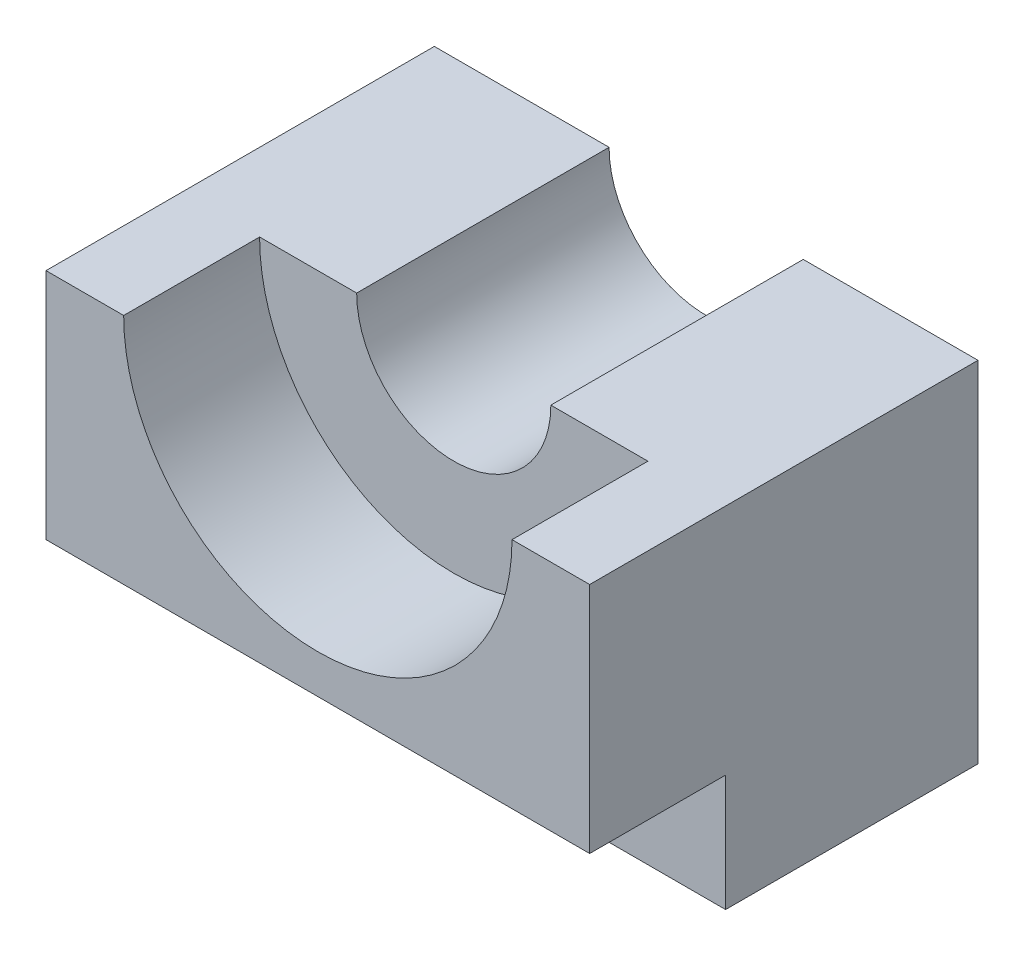
ISO-10303-21;
HEADER;
FILE_DESCRIPTION(('STEP AP214'),'2;1');
FILE_NAME('part.step','',(''),(''),'','','');
FILE_SCHEMA(('AUTOMOTIVE_DESIGN { 1 0 10303 214 1 1 1 1 }'));
ENDSEC;
DATA;
#1=APPLICATION_CONTEXT('core data for automotive mechanical design processes');
#2=APPLICATION_PROTOCOL_DEFINITION('international standard','automotive_design',2000,#1);
#3=PRODUCT_CONTEXT('',#1,'mechanical');
#4=PRODUCT('Part','Part','',(#3));
#5=PRODUCT_RELATED_PRODUCT_CATEGORY('part','',(#4));
#6=PRODUCT_DEFINITION_FORMATION('','',#4);
#7=PRODUCT_DEFINITION_CONTEXT('part definition',#1,'design');
#8=PRODUCT_DEFINITION('design','',#6,#7);
#9=PRODUCT_DEFINITION_SHAPE('','',#8);
#10=(LENGTH_UNIT() NAMED_UNIT(*) SI_UNIT(.MILLI.,.METRE.));
#11=(NAMED_UNIT(*) PLANE_ANGLE_UNIT() SI_UNIT($,.RADIAN.));
#12=(NAMED_UNIT(*) SI_UNIT($,.STERADIAN.) SOLID_ANGLE_UNIT());
#13=UNCERTAINTY_MEASURE_WITH_UNIT(LENGTH_MEASURE(1.E-05),#10,'distance_accuracy_value','');
#14=(GEOMETRIC_REPRESENTATION_CONTEXT(3) GLOBAL_UNCERTAINTY_ASSIGNED_CONTEXT((#13)) GLOBAL_UNIT_ASSIGNED_CONTEXT((#10,
#11,#12)) REPRESENTATION_CONTEXT('',''));
#15=CARTESIAN_POINT('',(0.,0.,0.));
#16=DIRECTION('',(0.,0.,1.));
#17=DIRECTION('',(1.,0.,0.));
#18=AXIS2_PLACEMENT_3D('',#15,#16,#17);
#19=CARTESIAN_POINT('',(0.,0.,13.));
#20=DIRECTION('',(0.,0.,1.));
#21=DIRECTION('',(1.,0.,0.));
#22=AXIS2_PLACEMENT_3D('',#19,#20,#21);
#23=PLANE('',#22);
#24=DIRECTION('',(1.,0.,0.));
#25=VECTOR('',#24,1.);
#26=CARTESIAN_POINT('',(0.,9.,13.));
#27=LINE('',#26,#25);
#28=CARTESIAN_POINT('',(-10.,9.,13.));
#29=VERTEX_POINT('',#28);
#30=CARTESIAN_POINT('',(-5.,9.,13.));
#31=VERTEX_POINT('',#30);
#32=EDGE_CURVE('E121',#29,#31,#27,.T.);
#33=ORIENTED_EDGE('',*,*,#32,.F.);
#34=CARTESIAN_POINT('',(0.,9.,13.));
#35=DIRECTION('',(0.,0.,1.));
#36=DIRECTION('',(1.,0.,0.));
#37=AXIS2_PLACEMENT_3D('',#34,#35,#36);
#38=CIRCLE('',#37,10.);
#39=CARTESIAN_POINT('',(10.,9.,13.));
#40=VERTEX_POINT('',#39);
#41=EDGE_CURVE('E11',#29,#40,#38,.T.);
#42=ORIENTED_EDGE('',*,*,#41,.T.);
#43=DIRECTION('',(1.,0.,0.));
#44=VECTOR('',#43,1.);
#45=CARTESIAN_POINT('',(0.,9.,13.));
#46=LINE('',#45,#44);
#47=CARTESIAN_POINT('',(5.,9.,13.));
#48=VERTEX_POINT('',#47);
#49=EDGE_CURVE('E99',#48,#40,#46,.T.);
#50=ORIENTED_EDGE('',*,*,#49,.F.);
#51=CARTESIAN_POINT('',(0.,9.,13.));
#52=DIRECTION('',(0.,0.,1.));
#53=DIRECTION('',(1.,0.,0.));
#54=AXIS2_PLACEMENT_3D('',#51,#52,#53);
#55=CIRCLE('',#54,5.);
#56=EDGE_CURVE('E95',#31,#48,#55,.T.);
#57=ORIENTED_EDGE('',*,*,#56,.F.);
#58=EDGE_LOOP('',(#33,#42,#50,#57));
#59=FACE_BOUND('',#58,.T.);
#60=ADVANCED_FACE('F47',(#59),#23,.T.);
#61=CARTESIAN_POINT('',(0.,9.,13.));
#62=DIRECTION('',(0.,0.,-1.));
#63=DIRECTION('',(-1.,0.,0.));
#64=AXIS2_PLACEMENT_3D('',#61,#62,#63);
#65=CYLINDRICAL_SURFACE('',#64,5.);
#66=CARTESIAN_POINT('',(0.,9.,0.));
#67=DIRECTION('',(0.,0.,1.));
#68=DIRECTION('',(1.,0.,0.));
#69=AXIS2_PLACEMENT_3D('',#66,#67,#68);
#70=CIRCLE('',#69,5.);
#71=CARTESIAN_POINT('',(-5.,9.,0.));
#72=VERTEX_POINT('',#71);
#73=CARTESIAN_POINT('',(5.,9.,0.));
#74=VERTEX_POINT('',#73);
#75=EDGE_CURVE('E92',#72,#74,#70,.T.);
#76=ORIENTED_EDGE('',*,*,#75,.F.);
#77=DIRECTION('',(0.,0.,-1.));
#78=VECTOR('',#77,1.);
#79=CARTESIAN_POINT('',(-5.,9.,13.));
#80=LINE('',#79,#78);
#81=EDGE_CURVE('E51',#31,#72,#80,.T.);
#82=ORIENTED_EDGE('',*,*,#81,.F.);
#83=ORIENTED_EDGE('',*,*,#56,.T.);
#84=DIRECTION('',(0.,0.,-1.));
#85=VECTOR('',#84,1.);
#86=CARTESIAN_POINT('',(5.,9.,13.));
#87=LINE('',#86,#85);
#88=EDGE_CURVE('E72',#48,#74,#87,.T.);
#89=ORIENTED_EDGE('',*,*,#88,.T.);
#90=EDGE_LOOP('',(#76,#82,#83,#89));
#91=FACE_BOUND('',#90,.T.);
#92=ADVANCED_FACE('F49',(#91),#65,.F.);
#93=CARTESIAN_POINT('',(0.,9.,13.));
#94=DIRECTION('',(0.,1.,0.));
#95=DIRECTION('',(0.,0.,1.));
#96=AXIS2_PLACEMENT_3D('',#93,#94,#95);
#97=PLANE('',#96);
#98=DIRECTION('',(1.,0.,0.));
#99=VECTOR('',#98,1.);
#100=CARTESIAN_POINT('',(0.,9.,0.));
#101=LINE('',#100,#99);
#102=CARTESIAN_POINT('',(-14.,9.,0.));
#103=VERTEX_POINT('',#102);
#104=EDGE_CURVE('E108',#103,#72,#101,.T.);
#105=ORIENTED_EDGE('',*,*,#104,.F.);
#106=DIRECTION('',(0.,0.,-1.));
#107=VECTOR('',#106,1.);
#108=CARTESIAN_POINT('',(-14.,9.,13.));
#109=LINE('',#108,#107);
#110=CARTESIAN_POINT('',(-14.,9.,20.));
#111=VERTEX_POINT('',#110);
#112=EDGE_CURVE('E128',#111,#103,#109,.T.);
#113=ORIENTED_EDGE('',*,*,#112,.F.);
#114=DIRECTION('',(-1.,0.,0.));
#115=VECTOR('',#114,1.);
#116=CARTESIAN_POINT('',(0.,9.,20.));
#117=LINE('',#116,#115);
#118=CARTESIAN_POINT('',(-10.,9.,20.));
#119=VERTEX_POINT('',#118);
#120=EDGE_CURVE('E183',#119,#111,#117,.T.);
#121=ORIENTED_EDGE('',*,*,#120,.F.);
#122=DIRECTION('',(0.,0.,-1.));
#123=VECTOR('',#122,1.);
#124=CARTESIAN_POINT('',(-10.,9.,20.));
#125=LINE('',#124,#123);
#126=EDGE_CURVE('E110',#119,#29,#125,.T.);
#127=ORIENTED_EDGE('',*,*,#126,.T.);
#128=ORIENTED_EDGE('',*,*,#32,.T.);
#129=ORIENTED_EDGE('',*,*,#81,.T.);
#130=EDGE_LOOP('',(#105,#113,#121,#127,#128,#129));
#131=FACE_BOUND('',#130,.T.);
#132=ADVANCED_FACE('F136',(#131),#97,.T.);
#133=CARTESIAN_POINT('',(-14.,0.,13.));
#134=DIRECTION('',(-1.,0.,0.));
#135=DIRECTION('',(0.,0.,1.));
#136=AXIS2_PLACEMENT_3D('',#133,#134,#135);
#137=PLANE('',#136);
#138=DIRECTION('',(0.,1.,0.));
#139=VECTOR('',#138,1.);
#140=CARTESIAN_POINT('',(-14.,0.,0.));
#141=LINE('',#140,#139);
#142=CARTESIAN_POINT('',(-14.,-9.,0.));
#143=VERTEX_POINT('',#142);
#144=EDGE_CURVE('E123',#143,#103,#141,.T.);
#145=ORIENTED_EDGE('',*,*,#144,.F.);
#146=DIRECTION('',(0.,0.,-1.));
#147=VECTOR('',#146,1.);
#148=CARTESIAN_POINT('',(-14.,-9.,13.));
#149=LINE('',#148,#147);
#150=CARTESIAN_POINT('',(-14.,-9.,13.));
#151=VERTEX_POINT('',#150);
#152=EDGE_CURVE('E157',#151,#143,#149,.T.);
#153=ORIENTED_EDGE('',*,*,#152,.F.);
#154=DIRECTION('',(0.,1.,0.));
#155=VECTOR('',#154,1.);
#156=CARTESIAN_POINT('',(-14.,0.,13.));
#157=LINE('',#156,#155);
#158=CARTESIAN_POINT('',(-14.,-3.,13.));
#159=VERTEX_POINT('',#158);
#160=EDGE_CURVE('E249',#151,#159,#157,.T.);
#161=ORIENTED_EDGE('',*,*,#160,.T.);
#162=DIRECTION('',(0.,0.,-1.));
#163=VECTOR('',#162,1.);
#164=CARTESIAN_POINT('',(-14.,-3.,20.));
#165=LINE('',#164,#163);
#166=CARTESIAN_POINT('',(-14.,-3.,20.));
#167=VERTEX_POINT('',#166);
#168=EDGE_CURVE('E209',#167,#159,#165,.T.);
#169=ORIENTED_EDGE('',*,*,#168,.F.);
#170=DIRECTION('',(0.,-1.,0.));
#171=VECTOR('',#170,1.);
#172=CARTESIAN_POINT('',(-14.,0.,20.));
#173=LINE('',#172,#171);
#174=EDGE_CURVE('E187',#111,#167,#173,.T.);
#175=ORIENTED_EDGE('',*,*,#174,.F.);
#176=ORIENTED_EDGE('',*,*,#112,.T.);
#177=EDGE_LOOP('',(#145,#153,#161,#169,#175,#176));
#178=FACE_BOUND('',#177,.T.);
#179=ADVANCED_FACE('F154',(#178),#137,.T.);
#180=CARTESIAN_POINT('',(14.,0.,13.));
#181=DIRECTION('',(-1.,0.,0.));
#182=DIRECTION('',(0.,0.,1.));
#183=AXIS2_PLACEMENT_3D('',#180,#181,#182);
#184=PLANE('',#183);
#185=DIRECTION('',(0.,0.,-1.));
#186=VECTOR('',#185,1.);
#187=CARTESIAN_POINT('',(14.,-9.,13.));
#188=LINE('',#187,#186);
#189=CARTESIAN_POINT('',(14.,-9.,13.));
#190=VERTEX_POINT('',#189);
#191=CARTESIAN_POINT('',(14.,-9.,0.));
#192=VERTEX_POINT('',#191);
#193=EDGE_CURVE('E170',#190,#192,#188,.T.);
#194=ORIENTED_EDGE('',*,*,#193,.T.);
#195=DIRECTION('',(0.,1.,0.));
#196=VECTOR('',#195,1.);
#197=CARTESIAN_POINT('',(14.,0.,0.));
#198=LINE('',#197,#196);
#199=CARTESIAN_POINT('',(14.,9.,0.));
#200=VERTEX_POINT('',#199);
#201=EDGE_CURVE('E117',#192,#200,#198,.T.);
#202=ORIENTED_EDGE('',*,*,#201,.T.);
#203=DIRECTION('',(0.,0.,-1.));
#204=VECTOR('',#203,1.);
#205=CARTESIAN_POINT('',(14.,9.,13.));
#206=LINE('',#205,#204);
#207=CARTESIAN_POINT('',(14.,9.,20.));
#208=VERTEX_POINT('',#207);
#209=EDGE_CURVE('E98',#208,#200,#206,.T.);
#210=ORIENTED_EDGE('',*,*,#209,.F.);
#211=DIRECTION('',(0.,1.,0.));
#212=VECTOR('',#211,1.);
#213=CARTESIAN_POINT('',(14.,0.,20.));
#214=LINE('',#213,#212);
#215=CARTESIAN_POINT('',(14.,-3.,20.));
#216=VERTEX_POINT('',#215);
#217=EDGE_CURVE('E195',#216,#208,#214,.T.);
#218=ORIENTED_EDGE('',*,*,#217,.F.);
#219=DIRECTION('',(0.,0.,-1.));
#220=VECTOR('',#219,1.);
#221=CARTESIAN_POINT('',(14.,-3.,20.));
#222=LINE('',#221,#220);
#223=CARTESIAN_POINT('',(14.,-3.,13.));
#224=VERTEX_POINT('',#223);
#225=EDGE_CURVE('E205',#216,#224,#222,.T.);
#226=ORIENTED_EDGE('',*,*,#225,.T.);
#227=DIRECTION('',(0.,1.,0.));
#228=VECTOR('',#227,1.);
#229=CARTESIAN_POINT('',(14.,0.,13.));
#230=LINE('',#229,#228);
#231=EDGE_CURVE('E177',#190,#224,#230,.T.);
#232=ORIENTED_EDGE('',*,*,#231,.F.);
#233=EDGE_LOOP('',(#194,#202,#210,#218,#226,#232));
#234=FACE_BOUND('',#233,.T.);
#235=ADVANCED_FACE('F241',(#234),#184,.F.);
#236=CARTESIAN_POINT('',(0.,9.,13.));
#237=DIRECTION('',(0.,1.,0.));
#238=DIRECTION('',(0.,0.,1.));
#239=AXIS2_PLACEMENT_3D('',#236,#237,#238);
#240=PLANE('',#239);
#241=DIRECTION('',(1.,0.,0.));
#242=VECTOR('',#241,1.);
#243=CARTESIAN_POINT('',(0.,9.,0.));
#244=LINE('',#243,#242);
#245=EDGE_CURVE('E105',#74,#200,#244,.T.);
#246=ORIENTED_EDGE('',*,*,#245,.F.);
#247=ORIENTED_EDGE('',*,*,#88,.F.);
#248=ORIENTED_EDGE('',*,*,#49,.T.);
#249=DIRECTION('',(0.,0.,-1.));
#250=VECTOR('',#249,1.);
#251=CARTESIAN_POINT('',(10.,9.,20.));
#252=LINE('',#251,#250);
#253=CARTESIAN_POINT('',(10.,9.,20.));
#254=VERTEX_POINT('',#253);
#255=EDGE_CURVE('E64',#254,#40,#252,.T.);
#256=ORIENTED_EDGE('',*,*,#255,.F.);
#257=DIRECTION('',(-1.,0.,0.));
#258=VECTOR('',#257,1.);
#259=CARTESIAN_POINT('',(0.,9.,20.));
#260=LINE('',#259,#258);
#261=EDGE_CURVE('E199',#208,#254,#260,.T.);
#262=ORIENTED_EDGE('',*,*,#261,.F.);
#263=ORIENTED_EDGE('',*,*,#209,.T.);
#264=EDGE_LOOP('',(#246,#247,#248,#256,#262,#263));
#265=FACE_BOUND('',#264,.T.);
#266=ADVANCED_FACE('F112',(#265),#240,.T.);
#267=CARTESIAN_POINT('',(0.,0.,0.));
#268=DIRECTION('',(0.,0.,1.));
#269=DIRECTION('',(1.,0.,0.));
#270=AXIS2_PLACEMENT_3D('',#267,#268,#269);
#271=PLANE('',#270);
#272=ORIENTED_EDGE('',*,*,#75,.T.);
#273=ORIENTED_EDGE('',*,*,#245,.T.);
#274=ORIENTED_EDGE('',*,*,#201,.F.);
#275=DIRECTION('',(1.,0.,0.));
#276=VECTOR('',#275,1.);
#277=CARTESIAN_POINT('',(0.,-9.,0.));
#278=LINE('',#277,#276);
#279=EDGE_CURVE('E151',#143,#192,#278,.T.);
#280=ORIENTED_EDGE('',*,*,#279,.F.);
#281=ORIENTED_EDGE('',*,*,#144,.T.);
#282=ORIENTED_EDGE('',*,*,#104,.T.);
#283=EDGE_LOOP('',(#272,#273,#274,#280,#281,#282));
#284=FACE_BOUND('',#283,.T.);
#285=ADVANCED_FACE('F103',(#284),#271,.F.);
#286=CARTESIAN_POINT('',(0.,9.,20.));
#287=DIRECTION('',(0.,0.,-1.));
#288=DIRECTION('',(-1.,0.,0.));
#289=AXIS2_PLACEMENT_3D('',#286,#287,#288);
#290=CYLINDRICAL_SURFACE('',#289,10.);
#291=ORIENTED_EDGE('',*,*,#41,.F.);
#292=ORIENTED_EDGE('',*,*,#126,.F.);
#293=CARTESIAN_POINT('',(0.,9.,20.));
#294=DIRECTION('',(0.,0.,1.));
#295=DIRECTION('',(1.,0.,0.));
#296=AXIS2_PLACEMENT_3D('',#293,#294,#295);
#297=CIRCLE('',#296,10.);
#298=EDGE_CURVE('E175',#119,#254,#297,.T.);
#299=ORIENTED_EDGE('',*,*,#298,.T.);
#300=ORIENTED_EDGE('',*,*,#255,.T.);
#301=EDGE_LOOP('',(#291,#292,#299,#300));
#302=FACE_BOUND('',#301,.T.);
#303=ADVANCED_FACE('F221',(#302),#290,.F.);
#304=CARTESIAN_POINT('',(0.,-3.,20.));
#305=DIRECTION('',(0.,1.,0.));
#306=DIRECTION('',(0.,0.,1.));
#307=AXIS2_PLACEMENT_3D('',#304,#305,#306);
#308=PLANE('',#307);
#309=DIRECTION('',(1.,0.,0.));
#310=VECTOR('',#309,1.);
#311=CARTESIAN_POINT('',(0.,-3.,13.));
#312=LINE('',#311,#310);
#313=EDGE_CURVE('E169',#159,#224,#312,.T.);
#314=ORIENTED_EDGE('',*,*,#313,.T.);
#315=ORIENTED_EDGE('',*,*,#225,.F.);
#316=DIRECTION('',(1.,0.,0.));
#317=VECTOR('',#316,1.);
#318=CARTESIAN_POINT('',(0.,-3.,20.));
#319=LINE('',#318,#317);
#320=EDGE_CURVE('E191',#167,#216,#319,.T.);
#321=ORIENTED_EDGE('',*,*,#320,.F.);
#322=ORIENTED_EDGE('',*,*,#168,.T.);
#323=EDGE_LOOP('',(#314,#315,#321,#322));
#324=FACE_BOUND('',#323,.T.);
#325=ADVANCED_FACE('F254',(#324),#308,.F.);
#326=CARTESIAN_POINT('',(0.,0.,20.));
#327=DIRECTION('',(0.,0.,1.));
#328=DIRECTION('',(1.,0.,0.));
#329=AXIS2_PLACEMENT_3D('',#326,#327,#328);
#330=PLANE('',#329);
#331=ORIENTED_EDGE('',*,*,#298,.F.);
#332=ORIENTED_EDGE('',*,*,#120,.T.);
#333=ORIENTED_EDGE('',*,*,#174,.T.);
#334=ORIENTED_EDGE('',*,*,#320,.T.);
#335=ORIENTED_EDGE('',*,*,#217,.T.);
#336=ORIENTED_EDGE('',*,*,#261,.T.);
#337=EDGE_LOOP('',(#331,#332,#333,#334,#335,#336));
#338=FACE_BOUND('',#337,.T.);
#339=ADVANCED_FACE('F236',(#338),#330,.T.);
#340=CARTESIAN_POINT('',(0.,-9.,13.));
#341=DIRECTION('',(0.,1.,0.));
#342=DIRECTION('',(0.,0.,1.));
#343=AXIS2_PLACEMENT_3D('',#340,#341,#342);
#344=PLANE('',#343);
#345=ORIENTED_EDGE('',*,*,#279,.T.);
#346=ORIENTED_EDGE('',*,*,#193,.F.);
#347=DIRECTION('',(1.,0.,0.));
#348=VECTOR('',#347,1.);
#349=CARTESIAN_POINT('',(0.,-9.,13.));
#350=LINE('',#349,#348);
#351=EDGE_CURVE('E166',#151,#190,#350,.T.);
#352=ORIENTED_EDGE('',*,*,#351,.F.);
#353=ORIENTED_EDGE('',*,*,#152,.T.);
#354=EDGE_LOOP('',(#345,#346,#352,#353));
#355=FACE_BOUND('',#354,.T.);
#356=ADVANCED_FACE('F162',(#355),#344,.F.);
#357=ORIENTED_EDGE('',*,*,#313,.F.);
#358=ORIENTED_EDGE('',*,*,#160,.F.);
#359=ORIENTED_EDGE('',*,*,#351,.T.);
#360=ORIENTED_EDGE('',*,*,#231,.T.);
#361=EDGE_LOOP('',(#357,#358,#359,#360));
#362=FACE_BOUND('',#361,.T.);
#363=ADVANCED_FACE('F248',(#362),#23,.T.);
#364=CLOSED_SHELL('',(#60,#92,#132,#179,#235,#266,#285,#303,#325,#339,#356,#363));
#365=MANIFOLD_SOLID_BREP('B2',#364);
#366=ADVANCED_BREP_SHAPE_REPRESENTATION('',(#18,#365),#14);
#367=SHAPE_DEFINITION_REPRESENTATION(#9,#366);
ENDSEC;
END-ISO-10303-21;
